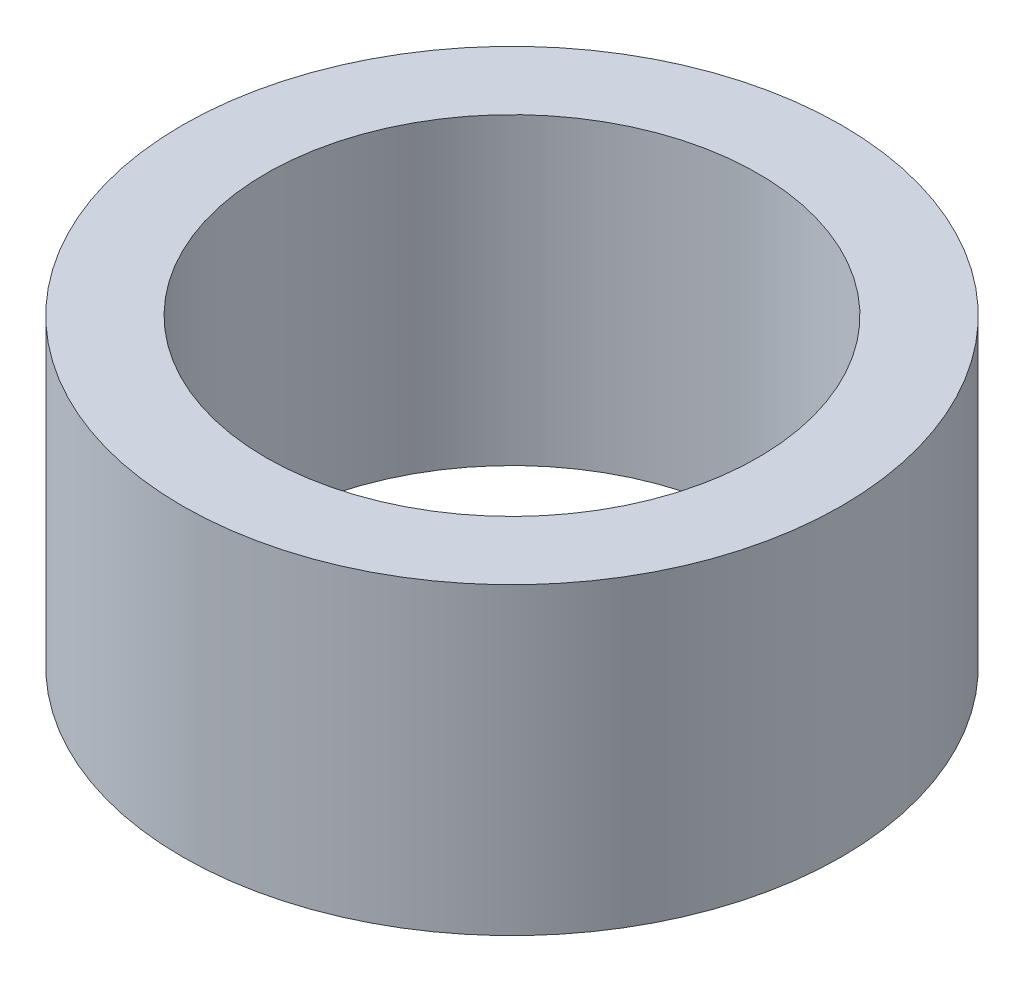
ISO-10303-21;
HEADER;
FILE_DESCRIPTION(('STEP AP214'),'2;1');
FILE_NAME('part.step','',(''),(''),'','','');
FILE_SCHEMA(('AUTOMOTIVE_DESIGN { 1 0 10303 214 1 1 1 1 }'));
ENDSEC;
DATA;
#1=APPLICATION_CONTEXT('core data for automotive mechanical design processes');
#2=APPLICATION_PROTOCOL_DEFINITION('international standard','automotive_design',2000,#1);
#3=PRODUCT_CONTEXT('',#1,'mechanical');
#4=PRODUCT('Part','Part','',(#3));
#5=PRODUCT_RELATED_PRODUCT_CATEGORY('part','',(#4));
#6=PRODUCT_DEFINITION_FORMATION('','',#4);
#7=PRODUCT_DEFINITION_CONTEXT('part definition',#1,'design');
#8=PRODUCT_DEFINITION('design','',#6,#7);
#9=PRODUCT_DEFINITION_SHAPE('','',#8);
#10=(LENGTH_UNIT() NAMED_UNIT(*) SI_UNIT(.MILLI.,.METRE.));
#11=(NAMED_UNIT(*) PLANE_ANGLE_UNIT() SI_UNIT($,.RADIAN.));
#12=(NAMED_UNIT(*) SI_UNIT($,.STERADIAN.) SOLID_ANGLE_UNIT());
#13=UNCERTAINTY_MEASURE_WITH_UNIT(LENGTH_MEASURE(1.E-05),#10,'distance_accuracy_value','');
#14=(GEOMETRIC_REPRESENTATION_CONTEXT(3) GLOBAL_UNCERTAINTY_ASSIGNED_CONTEXT((#13)) GLOBAL_UNIT_ASSIGNED_CONTEXT((#10,
#11,#12)) REPRESENTATION_CONTEXT('',''));
#15=CARTESIAN_POINT('',(0.,0.,0.));
#16=DIRECTION('',(0.,0.,1.));
#17=DIRECTION('',(1.,0.,0.));
#18=AXIS2_PLACEMENT_3D('',#15,#16,#17);
#19=CARTESIAN_POINT('',(0.,-10.9,0.));
#20=DIRECTION('',(0.,1.,0.));
#21=DIRECTION('',(0.,0.,1.));
#22=AXIS2_PLACEMENT_3D('',#19,#20,#21);
#23=CYLINDRICAL_SURFACE('',#22,11.825);
#24=CARTESIAN_POINT('',(0.,-10.9,0.));
#25=DIRECTION('',(0.,1.,0.));
#26=DIRECTION('',(0.,0.,1.));
#27=AXIS2_PLACEMENT_3D('',#24,#25,#26);
#28=CIRCLE('',#27,11.825);
#29=CARTESIAN_POINT('',(0.,-10.9,11.825));
#30=VERTEX_POINT('',#29);
#31=EDGE_CURVE('E10',#30,#30,#28,.T.);
#32=ORIENTED_EDGE('',*,*,#31,.T.);
#33=EDGE_LOOP('',(#32));
#34=FACE_BOUND('',#33,.T.);
#35=CARTESIAN_POINT('',(0.,0.,0.));
#36=DIRECTION('',(0.,1.,0.));
#37=DIRECTION('',(0.,0.,1.));
#38=AXIS2_PLACEMENT_3D('',#35,#36,#37);
#39=CIRCLE('',#38,11.825);
#40=CARTESIAN_POINT('',(0.,0.,11.825));
#41=VERTEX_POINT('',#40);
#42=EDGE_CURVE('E34',#41,#41,#39,.T.);
#43=ORIENTED_EDGE('',*,*,#42,.F.);
#44=EDGE_LOOP('',(#43));
#45=FACE_BOUND('',#44,.T.);
#46=ADVANCED_FACE('F31',(#34,#45),#23,.T.);
#47=CARTESIAN_POINT('',(0.,-10.9,0.));
#48=DIRECTION('',(0.,1.,0.));
#49=DIRECTION('',(0.,0.,1.));
#50=AXIS2_PLACEMENT_3D('',#47,#48,#49);
#51=PLANE('',#50);
#52=CARTESIAN_POINT('',(0.,-10.9,0.));
#53=DIRECTION('',(0.,1.,0.));
#54=DIRECTION('',(0.,0.,1.));
#55=AXIS2_PLACEMENT_3D('',#52,#53,#54);
#56=CIRCLE('',#55,8.825);
#57=CARTESIAN_POINT('',(0.,-10.9,8.825));
#58=VERTEX_POINT('',#57);
#59=EDGE_CURVE('E41',#58,#58,#56,.T.);
#60=ORIENTED_EDGE('',*,*,#59,.T.);
#61=EDGE_LOOP('',(#60));
#62=FACE_BOUND('',#61,.T.);
#63=ORIENTED_EDGE('',*,*,#31,.F.);
#64=EDGE_LOOP('',(#63));
#65=FACE_BOUND('',#64,.T.);
#66=ADVANCED_FACE('F49',(#62,#65),#51,.F.);
#67=CARTESIAN_POINT('',(0.,0.,0.));
#68=DIRECTION('',(0.,1.,0.));
#69=DIRECTION('',(0.,0.,1.));
#70=AXIS2_PLACEMENT_3D('',#67,#68,#69);
#71=PLANE('',#70);
#72=CARTESIAN_POINT('',(0.,0.,0.));
#73=DIRECTION('',(0.,1.,0.));
#74=DIRECTION('',(0.,0.,1.));
#75=AXIS2_PLACEMENT_3D('',#72,#73,#74);
#76=CIRCLE('',#75,8.825);
#77=CARTESIAN_POINT('',(0.,0.,8.825));
#78=VERTEX_POINT('',#77);
#79=EDGE_CURVE('E43',#78,#78,#76,.T.);
#80=ORIENTED_EDGE('',*,*,#79,.F.);
#81=EDGE_LOOP('',(#80));
#82=FACE_BOUND('',#81,.T.);
#83=ORIENTED_EDGE('',*,*,#42,.T.);
#84=EDGE_LOOP('',(#83));
#85=FACE_BOUND('',#84,.T.);
#86=ADVANCED_FACE('F55',(#82,#85),#71,.T.);
#87=CARTESIAN_POINT('',(0.,-10.9,0.));
#88=DIRECTION('',(0.,1.,0.));
#89=DIRECTION('',(0.,0.,1.));
#90=AXIS2_PLACEMENT_3D('',#87,#88,#89);
#91=CYLINDRICAL_SURFACE('',#90,8.825);
#92=ORIENTED_EDGE('',*,*,#59,.F.);
#93=EDGE_LOOP('',(#92));
#94=FACE_BOUND('',#93,.T.);
#95=ORIENTED_EDGE('',*,*,#79,.T.);
#96=EDGE_LOOP('',(#95));
#97=FACE_BOUND('',#96,.T.);
#98=ADVANCED_FACE('F52',(#94,#97),#91,.F.);
#99=CLOSED_SHELL('',(#46,#66,#86,#98));
#100=MANIFOLD_SOLID_BREP('B2',#99);
#101=ADVANCED_BREP_SHAPE_REPRESENTATION('',(#18,#100),#14);
#102=SHAPE_DEFINITION_REPRESENTATION(#9,#101);
ENDSEC;
END-ISO-10303-21;
